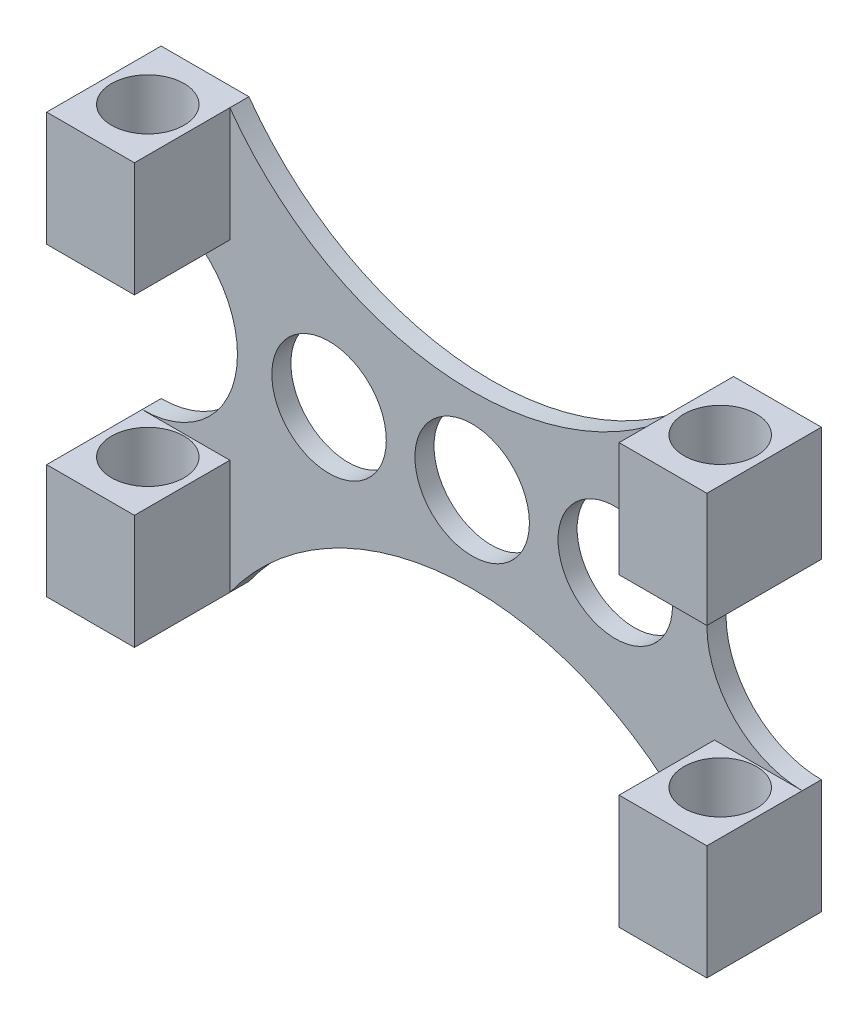
ISO-10303-21;
HEADER;
FILE_DESCRIPTION(('STEP AP214'),'2;1');
FILE_NAME('part.step','',(''),(''),'','','');
FILE_SCHEMA(('AUTOMOTIVE_DESIGN { 1 0 10303 214 1 1 1 1 }'));
ENDSEC;
DATA;
#1=APPLICATION_CONTEXT('core data for automotive mechanical design processes');
#2=APPLICATION_PROTOCOL_DEFINITION('international standard','automotive_design',2000,#1);
#3=PRODUCT_CONTEXT('',#1,'mechanical');
#4=PRODUCT('Part','Part','',(#3));
#5=PRODUCT_RELATED_PRODUCT_CATEGORY('part','',(#4));
#6=PRODUCT_DEFINITION_FORMATION('','',#4);
#7=PRODUCT_DEFINITION_CONTEXT('part definition',#1,'design');
#8=PRODUCT_DEFINITION('design','',#6,#7);
#9=PRODUCT_DEFINITION_SHAPE('','',#8);
#10=(LENGTH_UNIT() NAMED_UNIT(*) SI_UNIT(.MILLI.,.METRE.));
#11=(NAMED_UNIT(*) PLANE_ANGLE_UNIT() SI_UNIT($,.RADIAN.));
#12=(NAMED_UNIT(*) SI_UNIT($,.STERADIAN.) SOLID_ANGLE_UNIT());
#13=UNCERTAINTY_MEASURE_WITH_UNIT(LENGTH_MEASURE(1.E-05),#10,'distance_accuracy_value','');
#14=(GEOMETRIC_REPRESENTATION_CONTEXT(3) GLOBAL_UNCERTAINTY_ASSIGNED_CONTEXT((#13)) GLOBAL_UNIT_ASSIGNED_CONTEXT((#10,
#11,#12)) REPRESENTATION_CONTEXT('',''));
#15=CARTESIAN_POINT('',(0.,0.,0.));
#16=DIRECTION('',(0.,0.,1.));
#17=DIRECTION('',(1.,0.,0.));
#18=AXIS2_PLACEMENT_3D('',#15,#16,#17);
#19=CARTESIAN_POINT('',(-51.1120429281433,-49.8909296039153,5.));
#20=DIRECTION('',(0.,0.,1.));
#21=DIRECTION('',(1.,0.,0.));
#22=AXIS2_PLACEMENT_3D('',#19,#20,#21);
#23=PLANE('',#22);
#24=CARTESIAN_POINT('',(-2.11204292814329,-49.8909296039153,5.));
#25=DIRECTION('',(0.,0.,1.));
#26=DIRECTION('',(1.,0.,0.));
#27=AXIS2_PLACEMENT_3D('',#24,#25,#26);
#28=CIRCLE('',#27,15.);
#29=CARTESIAN_POINT('',(12.8879570718567,-49.8909296039153,5.));
#30=VERTEX_POINT('',#29);
#31=EDGE_CURVE('E311',#30,#30,#28,.T.);
#32=ORIENTED_EDGE('',*,*,#31,.F.);
#33=EDGE_LOOP('',(#32));
#34=FACE_BOUND('',#33,.T.);
#35=CARTESIAN_POINT('',(35.3879570718567,-49.8909296039153,5.));
#36=DIRECTION('',(0.,0.,1.));
#37=DIRECTION('',(1.,0.,0.));
#38=AXIS2_PLACEMENT_3D('',#35,#36,#37);
#39=CIRCLE('',#38,15.);
#40=CARTESIAN_POINT('',(50.3879570718567,-49.8909296039153,5.));
#41=VERTEX_POINT('',#40);
#42=EDGE_CURVE('E323',#41,#41,#39,.T.);
#43=ORIENTED_EDGE('',*,*,#42,.F.);
#44=EDGE_LOOP('',(#43));
#45=FACE_BOUND('',#44,.T.);
#46=CARTESIAN_POINT('',(72.8879570718567,-49.8909296039153,5.));
#47=DIRECTION('',(0.,0.,1.));
#48=DIRECTION('',(1.,0.,0.));
#49=AXIS2_PLACEMENT_3D('',#46,#47,#48);
#50=CIRCLE('',#49,15.);
#51=CARTESIAN_POINT('',(87.8879570718567,-49.8909296039153,5.));
#52=VERTEX_POINT('',#51);
#53=EDGE_CURVE('E317',#52,#52,#50,.T.);
#54=ORIENTED_EDGE('',*,*,#53,.F.);
#55=EDGE_LOOP('',(#54));
#56=FACE_BOUND('',#55,.T.);
#57=DIRECTION('',(-1.,0.,0.));
#58=VECTOR('',#57,1.);
#59=CARTESIAN_POINT('',(-51.1120429281432,-74.8909296039153,5.));
#60=LINE('',#59,#58);
#61=CARTESIAN_POINT('',(-28.1120429281433,-74.8909296039153,5.));
#62=VERTEX_POINT('',#61);
#63=CARTESIAN_POINT('',(-51.1120429281432,-74.8909296039153,5.));
#64=VERTEX_POINT('',#63);
#65=EDGE_CURVE('E50',#62,#64,#60,.T.);
#66=ORIENTED_EDGE('',*,*,#65,.F.);
#67=DIRECTION('',(0.,1.,0.));
#68=VECTOR('',#67,1.);
#69=CARTESIAN_POINT('',(-28.1120429281433,-104.890929603915,5.));
#70=LINE('',#69,#68);
#71=CARTESIAN_POINT('',(-28.1120429281433,-104.890929603915,5.));
#72=VERTEX_POINT('',#71);
#73=EDGE_CURVE('E214',#72,#62,#70,.T.);
#74=ORIENTED_EDGE('',*,*,#73,.F.);
#75=CARTESIAN_POINT('',(35.3879570718567,-150.404563471569,5.));
#76=DIRECTION('',(0.,0.,-1.));
#77=DIRECTION('',(-1.,0.,0.));
#78=AXIS2_PLACEMENT_3D('',#75,#76,#77);
#79=CIRCLE('',#78,78.1264415408689);
#80=CARTESIAN_POINT('',(98.8865470002782,-104.888962355677,5.));
#81=VERTEX_POINT('',#80);
#82=EDGE_CURVE('E331',#72,#81,#79,.T.);
#83=ORIENTED_EDGE('',*,*,#82,.T.);
#84=DIRECTION('',(0.,-1.,0.));
#85=VECTOR('',#84,1.);
#86=CARTESIAN_POINT('',(98.8865470002782,-104.890929603915,5.));
#87=LINE('',#86,#85);
#88=CARTESIAN_POINT('',(98.8865470002783,-74.8909296039153,5.));
#89=VERTEX_POINT('',#88);
#90=EDGE_CURVE('E57',#89,#81,#87,.T.);
#91=ORIENTED_EDGE('',*,*,#90,.F.);
#92=DIRECTION('',(-1.,0.,0.));
#93=VECTOR('',#92,1.);
#94=CARTESIAN_POINT('',(121.887957071857,-74.8909296039153,5.));
#95=LINE('',#94,#93);
#96=CARTESIAN_POINT('',(121.887957071857,-74.8909296039153,5.));
#97=VERTEX_POINT('',#96);
#98=EDGE_CURVE('E229',#97,#89,#95,.T.);
#99=ORIENTED_EDGE('',*,*,#98,.F.);
#100=CARTESIAN_POINT('',(121.887957071857,-49.8909296039153,5.));
#101=DIRECTION('',(0.,0.,-1.));
#102=DIRECTION('',(-1.,0.,0.));
#103=AXIS2_PLACEMENT_3D('',#100,#101,#102);
#104=CIRCLE('',#103,25.);
#105=CARTESIAN_POINT('',(121.887957071857,-24.8909296039153,5.));
#106=VERTEX_POINT('',#105);
#107=EDGE_CURVE('E334',#97,#106,#104,.T.);
#108=ORIENTED_EDGE('',*,*,#107,.T.);
#109=DIRECTION('',(1.,0.,0.));
#110=VECTOR('',#109,1.);
#111=CARTESIAN_POINT('',(121.887957071857,-24.8909296039153,5.));
#112=LINE('',#111,#110);
#113=CARTESIAN_POINT('',(98.8865470002782,-24.8909296039153,5.));
#114=VERTEX_POINT('',#113);
#115=EDGE_CURVE('E263',#114,#106,#112,.T.);
#116=ORIENTED_EDGE('',*,*,#115,.F.);
#117=DIRECTION('',(0.,-1.,0.));
#118=VECTOR('',#117,1.);
#119=CARTESIAN_POINT('',(98.8865470002782,5.10907039608473,5.));
#120=LINE('',#119,#118);
#121=CARTESIAN_POINT('',(98.8865470002782,5.10710314784629,5.));
#122=VERTEX_POINT('',#121);
#123=EDGE_CURVE('E271',#122,#114,#120,.T.);
#124=ORIENTED_EDGE('',*,*,#123,.F.);
#125=CARTESIAN_POINT('',(35.3879570718567,50.6227042637381,5.));
#126=DIRECTION('',(0.,0.,-1.));
#127=DIRECTION('',(1.,0.,0.));
#128=AXIS2_PLACEMENT_3D('',#125,#126,#127);
#129=CIRCLE('',#128,78.1264415408689);
#130=CARTESIAN_POINT('',(-28.1120429281433,5.10907039608473,5.));
#131=VERTEX_POINT('',#130);
#132=EDGE_CURVE('E336',#122,#131,#129,.T.);
#133=ORIENTED_EDGE('',*,*,#132,.T.);
#134=DIRECTION('',(0.,1.,0.));
#135=VECTOR('',#134,1.);
#136=CARTESIAN_POINT('',(-28.1120429281433,5.10907039608473,5.));
#137=LINE('',#136,#135);
#138=CARTESIAN_POINT('',(-28.1120429281433,-24.8909296039153,5.));
#139=VERTEX_POINT('',#138);
#140=EDGE_CURVE('E290',#139,#131,#137,.T.);
#141=ORIENTED_EDGE('',*,*,#140,.F.);
#142=DIRECTION('',(1.,0.,0.));
#143=VECTOR('',#142,1.);
#144=CARTESIAN_POINT('',(-51.1120429281433,-24.8909296039153,5.));
#145=LINE('',#144,#143);
#146=CARTESIAN_POINT('',(-51.1120429281433,-24.8909296039153,5.));
#147=VERTEX_POINT('',#146);
#148=EDGE_CURVE('E285',#147,#139,#145,.T.);
#149=ORIENTED_EDGE('',*,*,#148,.F.);
#150=CARTESIAN_POINT('',(-51.1120429281433,-49.8909296039153,5.));
#151=DIRECTION('',(0.,0.,-1.));
#152=DIRECTION('',(1.,0.,0.));
#153=AXIS2_PLACEMENT_3D('',#150,#151,#152);
#154=CIRCLE('',#153,25.);
#155=EDGE_CURVE('E329',#147,#64,#154,.T.);
#156=ORIENTED_EDGE('',*,*,#155,.T.);
#157=EDGE_LOOP('',(#66,#74,#83,#91,#99,#108,#116,#124,#133,#141,#149,#156));
#158=FACE_BOUND('',#157,.T.);
#159=ADVANCED_FACE('F33',(#34,#45,#56,#158),#23,.T.);
#160=CARTESIAN_POINT('',(-51.1120429281433,-49.8909296039153,0.));
#161=DIRECTION('',(0.,0.,1.));
#162=DIRECTION('',(1.,0.,0.));
#163=AXIS2_PLACEMENT_3D('',#160,#161,#162);
#164=PLANE('',#163);
#165=CARTESIAN_POINT('',(72.8879570718567,-49.8909296039153,0.));
#166=DIRECTION('',(0.,0.,1.));
#167=DIRECTION('',(1.,0.,0.));
#168=AXIS2_PLACEMENT_3D('',#165,#166,#167);
#169=CIRCLE('',#168,15.);
#170=CARTESIAN_POINT('',(87.8879570718567,-49.8909296039153,0.));
#171=VERTEX_POINT('',#170);
#172=EDGE_CURVE('E314',#171,#171,#169,.T.);
#173=ORIENTED_EDGE('',*,*,#172,.T.);
#174=EDGE_LOOP('',(#173));
#175=FACE_BOUND('',#174,.T.);
#176=DIRECTION('',(0.,-1.,0.));
#177=VECTOR('',#176,1.);
#178=CARTESIAN_POINT('',(-51.1120429281433,5.10907039608473,0.));
#179=LINE('',#178,#177);
#180=CARTESIAN_POINT('',(-51.1120429281433,5.10907039608473,0.));
#181=VERTEX_POINT('',#180);
#182=CARTESIAN_POINT('',(-51.1120429281433,-24.8909296039153,0.));
#183=VERTEX_POINT('',#182);
#184=EDGE_CURVE('E326',#181,#183,#179,.T.);
#185=ORIENTED_EDGE('',*,*,#184,.F.);
#186=DIRECTION('',(-1.,0.,0.));
#187=VECTOR('',#186,1.);
#188=CARTESIAN_POINT('',(-51.1120429281433,5.10907039608473,0.));
#189=LINE('',#188,#187);
#190=CARTESIAN_POINT('',(-28.1120429281433,5.10907039608473,0.));
#191=VERTEX_POINT('',#190);
#192=EDGE_CURVE('E332',#191,#181,#189,.T.);
#193=ORIENTED_EDGE('',*,*,#192,.F.);
#194=CARTESIAN_POINT('',(35.3879570718567,50.6227042637381,0.));
#195=DIRECTION('',(0.,0.,-1.));
#196=DIRECTION('',(1.,0.,0.));
#197=AXIS2_PLACEMENT_3D('',#194,#195,#196);
#198=CIRCLE('',#197,78.1264415408689);
#199=CARTESIAN_POINT('',(98.8879570718567,5.10907039608473,0.));
#200=VERTEX_POINT('',#199);
#201=EDGE_CURVE('E360',#200,#191,#198,.T.);
#202=ORIENTED_EDGE('',*,*,#201,.F.);
#203=DIRECTION('',(-1.,0.,0.));
#204=VECTOR('',#203,1.);
#205=CARTESIAN_POINT('',(98.8879570718567,5.10907039608473,0.));
#206=LINE('',#205,#204);
#207=CARTESIAN_POINT('',(121.887957071857,5.10907039608474,0.));
#208=VERTEX_POINT('',#207);
#209=EDGE_CURVE('E358',#208,#200,#206,.T.);
#210=ORIENTED_EDGE('',*,*,#209,.F.);
#211=DIRECTION('',(0.,1.,0.));
#212=VECTOR('',#211,1.);
#213=CARTESIAN_POINT('',(121.887957071857,5.10907039608474,0.));
#214=LINE('',#213,#212);
#215=CARTESIAN_POINT('',(121.887957071857,-24.8909296039153,0.));
#216=VERTEX_POINT('',#215);
#217=EDGE_CURVE('E356',#216,#208,#214,.T.);
#218=ORIENTED_EDGE('',*,*,#217,.F.);
#219=CARTESIAN_POINT('',(121.887957071857,-49.8909296039153,0.));
#220=DIRECTION('',(0.,0.,-1.));
#221=DIRECTION('',(-1.,0.,0.));
#222=AXIS2_PLACEMENT_3D('',#219,#220,#221);
#223=CIRCLE('',#222,25.);
#224=CARTESIAN_POINT('',(121.887957071857,-74.8909296039153,0.));
#225=VERTEX_POINT('',#224);
#226=EDGE_CURVE('E354',#225,#216,#223,.T.);
#227=ORIENTED_EDGE('',*,*,#226,.F.);
#228=DIRECTION('',(0.,1.,0.));
#229=VECTOR('',#228,1.);
#230=CARTESIAN_POINT('',(121.887957071857,-74.8909296039153,0.));
#231=LINE('',#230,#229);
#232=CARTESIAN_POINT('',(121.887957071857,-104.890929603915,0.));
#233=VERTEX_POINT('',#232);
#234=EDGE_CURVE('E352',#233,#225,#231,.T.);
#235=ORIENTED_EDGE('',*,*,#234,.F.);
#236=DIRECTION('',(1.,0.,0.));
#237=VECTOR('',#236,1.);
#238=CARTESIAN_POINT('',(98.8879570718567,-104.890929603915,0.));
#239=LINE('',#238,#237);
#240=CARTESIAN_POINT('',(98.8879570718567,-104.890929603915,0.));
#241=VERTEX_POINT('',#240);
#242=EDGE_CURVE('E350',#241,#233,#239,.T.);
#243=ORIENTED_EDGE('',*,*,#242,.F.);
#244=CARTESIAN_POINT('',(35.3879570718567,-150.404563471569,0.));
#245=DIRECTION('',(0.,0.,-1.));
#246=DIRECTION('',(-1.,0.,0.));
#247=AXIS2_PLACEMENT_3D('',#244,#245,#246);
#248=CIRCLE('',#247,78.1264415408689);
#249=CARTESIAN_POINT('',(-28.1120429281433,-104.890929603915,0.));
#250=VERTEX_POINT('',#249);
#251=EDGE_CURVE('E348',#250,#241,#248,.T.);
#252=ORIENTED_EDGE('',*,*,#251,.F.);
#253=DIRECTION('',(1.,0.,0.));
#254=VECTOR('',#253,1.);
#255=CARTESIAN_POINT('',(-51.1120429281432,-104.890929603915,0.));
#256=LINE('',#255,#254);
#257=CARTESIAN_POINT('',(-51.1120429281432,-104.890929603915,0.));
#258=VERTEX_POINT('',#257);
#259=EDGE_CURVE('E346',#258,#250,#256,.T.);
#260=ORIENTED_EDGE('',*,*,#259,.F.);
#261=DIRECTION('',(0.,-1.,0.));
#262=VECTOR('',#261,1.);
#263=CARTESIAN_POINT('',(-51.1120429281432,-74.8909296039153,0.));
#264=LINE('',#263,#262);
#265=CARTESIAN_POINT('',(-51.1120429281432,-74.8909296039153,0.));
#266=VERTEX_POINT('',#265);
#267=EDGE_CURVE('E194',#266,#258,#264,.T.);
#268=ORIENTED_EDGE('',*,*,#267,.F.);
#269=CARTESIAN_POINT('',(-51.1120429281433,-49.8909296039153,0.));
#270=DIRECTION('',(0.,0.,-1.));
#271=DIRECTION('',(1.,0.,0.));
#272=AXIS2_PLACEMENT_3D('',#269,#270,#271);
#273=CIRCLE('',#272,25.);
#274=EDGE_CURVE('E343',#183,#266,#273,.T.);
#275=ORIENTED_EDGE('',*,*,#274,.F.);
#276=EDGE_LOOP('',(#185,#193,#202,#210,#218,#227,#235,#243,#252,#260,#268,#275));
#277=FACE_BOUND('',#276,.T.);
#278=CARTESIAN_POINT('',(35.3879570718567,-49.8909296039153,0.));
#279=DIRECTION('',(0.,0.,1.));
#280=DIRECTION('',(1.,0.,0.));
#281=AXIS2_PLACEMENT_3D('',#278,#279,#280);
#282=CIRCLE('',#281,15.);
#283=CARTESIAN_POINT('',(50.3879570718567,-49.8909296039153,0.));
#284=VERTEX_POINT('',#283);
#285=EDGE_CURVE('E320',#284,#284,#282,.T.);
#286=ORIENTED_EDGE('',*,*,#285,.T.);
#287=EDGE_LOOP('',(#286));
#288=FACE_BOUND('',#287,.T.);
#289=CARTESIAN_POINT('',(-2.11204292814329,-49.8909296039153,0.));
#290=DIRECTION('',(0.,0.,1.));
#291=DIRECTION('',(1.,0.,0.));
#292=AXIS2_PLACEMENT_3D('',#289,#290,#291);
#293=CIRCLE('',#292,15.);
#294=CARTESIAN_POINT('',(12.8879570718567,-49.8909296039153,0.));
#295=VERTEX_POINT('',#294);
#296=EDGE_CURVE('E310',#295,#295,#293,.T.);
#297=ORIENTED_EDGE('',*,*,#296,.T.);
#298=EDGE_LOOP('',(#297));
#299=FACE_BOUND('',#298,.T.);
#300=ADVANCED_FACE('F427',(#175,#277,#288,#299),#164,.F.);
#301=CARTESIAN_POINT('',(-51.1120429281433,5.10907039608473,5.));
#302=DIRECTION('',(1.,0.,0.));
#303=DIRECTION('',(0.,1.,0.));
#304=AXIS2_PLACEMENT_3D('',#301,#302,#303);
#305=PLANE('',#304);
#306=ORIENTED_EDGE('',*,*,#184,.T.);
#307=DIRECTION('',(0.,0.,-1.));
#308=VECTOR('',#307,1.);
#309=CARTESIAN_POINT('',(-51.1120429281433,-24.8909296039153,5.));
#310=LINE('',#309,#308);
#311=EDGE_CURVE('E11',#147,#183,#310,.T.);
#312=ORIENTED_EDGE('',*,*,#311,.F.);
#313=DIRECTION('',(0.,0.,-1.));
#314=VECTOR('',#313,1.);
#315=CARTESIAN_POINT('',(-51.1120429281433,-24.8909296039153,30.));
#316=LINE('',#315,#314);
#317=CARTESIAN_POINT('',(-51.1120429281433,-24.8909296039153,30.));
#318=VERTEX_POINT('',#317);
#319=EDGE_CURVE('E307',#318,#147,#316,.T.);
#320=ORIENTED_EDGE('',*,*,#319,.F.);
#321=DIRECTION('',(0.,-1.,0.));
#322=VECTOR('',#321,1.);
#323=CARTESIAN_POINT('',(-51.1120429281433,5.10907039608473,30.));
#324=LINE('',#323,#322);
#325=CARTESIAN_POINT('',(-51.1120429281433,5.10907039608473,30.));
#326=VERTEX_POINT('',#325);
#327=EDGE_CURVE('E286',#326,#318,#324,.T.);
#328=ORIENTED_EDGE('',*,*,#327,.F.);
#329=DIRECTION('',(0.,0.,-1.));
#330=VECTOR('',#329,1.);
#331=CARTESIAN_POINT('',(-51.1120429281433,5.10907039608473,5.));
#332=LINE('',#331,#330);
#333=EDGE_CURVE('E340',#326,#181,#332,.T.);
#334=ORIENTED_EDGE('',*,*,#333,.T.);
#335=EDGE_LOOP('',(#306,#312,#320,#328,#334));
#336=FACE_BOUND('',#335,.T.);
#337=ADVANCED_FACE('F35',(#336),#305,.F.);
#338=CARTESIAN_POINT('',(-51.1120429281433,-49.8909296039153,5.));
#339=DIRECTION('',(0.,0.,-1.));
#340=DIRECTION('',(-1.,0.,0.));
#341=AXIS2_PLACEMENT_3D('',#338,#339,#340);
#342=CYLINDRICAL_SURFACE('',#341,25.);
#343=ORIENTED_EDGE('',*,*,#274,.T.);
#344=DIRECTION('',(0.,0.,-1.));
#345=VECTOR('',#344,1.);
#346=CARTESIAN_POINT('',(-51.1120429281432,-74.8909296039153,5.));
#347=LINE('',#346,#345);
#348=EDGE_CURVE('E42',#64,#266,#347,.T.);
#349=ORIENTED_EDGE('',*,*,#348,.F.);
#350=ORIENTED_EDGE('',*,*,#155,.F.);
#351=ORIENTED_EDGE('',*,*,#311,.T.);
#352=EDGE_LOOP('',(#343,#349,#350,#351));
#353=FACE_BOUND('',#352,.T.);
#354=ADVANCED_FACE('F424',(#353),#342,.F.);
#355=CARTESIAN_POINT('',(-51.1120429281432,-74.8909296039153,5.));
#356=DIRECTION('',(1.,0.,0.));
#357=DIRECTION('',(0.,0.,-1.));
#358=AXIS2_PLACEMENT_3D('',#355,#356,#357);
#359=PLANE('',#358);
#360=ORIENTED_EDGE('',*,*,#267,.T.);
#361=DIRECTION('',(0.,0.,-1.));
#362=VECTOR('',#361,1.);
#363=CARTESIAN_POINT('',(-51.1120429281432,-104.890929603915,5.));
#364=LINE('',#363,#362);
#365=CARTESIAN_POINT('',(-51.1120429281432,-104.890929603915,30.));
#366=VERTEX_POINT('',#365);
#367=EDGE_CURVE('E186',#366,#258,#364,.T.);
#368=ORIENTED_EDGE('',*,*,#367,.F.);
#369=DIRECTION('',(0.,-1.,0.));
#370=VECTOR('',#369,1.);
#371=CARTESIAN_POINT('',(-51.1120429281432,-104.890929603915,30.));
#372=LINE('',#371,#370);
#373=CARTESIAN_POINT('',(-51.1120429281432,-74.8909296039153,30.));
#374=VERTEX_POINT('',#373);
#375=EDGE_CURVE('E191',#374,#366,#372,.T.);
#376=ORIENTED_EDGE('',*,*,#375,.F.);
#377=DIRECTION('',(0.,0.,-1.));
#378=VECTOR('',#377,1.);
#379=CARTESIAN_POINT('',(-51.1120429281432,-74.8909296039153,30.));
#380=LINE('',#379,#378);
#381=EDGE_CURVE('E222',#374,#64,#380,.T.);
#382=ORIENTED_EDGE('',*,*,#381,.T.);
#383=ORIENTED_EDGE('',*,*,#348,.T.);
#384=EDGE_LOOP('',(#360,#368,#376,#382,#383));
#385=FACE_BOUND('',#384,.T.);
#386=ADVANCED_FACE('F188',(#385),#359,.F.);
#387=CARTESIAN_POINT('',(-51.1120429281432,-104.890929603915,5.));
#388=DIRECTION('',(0.,1.,0.));
#389=DIRECTION('',(0.,0.,1.));
#390=AXIS2_PLACEMENT_3D('',#387,#388,#389);
#391=PLANE('',#390);
#392=CARTESIAN_POINT('',(-39.6120429281433,-104.890929603915,15.));
#393=DIRECTION('',(0.,-1.,0.));
#394=DIRECTION('',(0.,0.,-1.));
#395=AXIS2_PLACEMENT_3D('',#392,#393,#394);
#396=CIRCLE('',#395,9.5);
#397=CARTESIAN_POINT('',(-39.6120429281433,-104.890929603915,5.5));
#398=VERTEX_POINT('',#397);
#399=EDGE_CURVE('E407',#398,#398,#396,.T.);
#400=ORIENTED_EDGE('',*,*,#399,.F.);
#401=EDGE_LOOP('',(#400));
#402=FACE_BOUND('',#401,.T.);
#403=ORIENTED_EDGE('',*,*,#259,.T.);
#404=DIRECTION('',(0.,0.,-1.));
#405=VECTOR('',#404,1.);
#406=CARTESIAN_POINT('',(-28.1120429281433,-104.890929603915,5.));
#407=LINE('',#406,#405);
#408=EDGE_CURVE('E197',#72,#250,#407,.T.);
#409=ORIENTED_EDGE('',*,*,#408,.F.);
#410=DIRECTION('',(0.,0.,-1.));
#411=VECTOR('',#410,1.);
#412=CARTESIAN_POINT('',(-28.1120429281433,-104.890929603915,30.));
#413=LINE('',#412,#411);
#414=CARTESIAN_POINT('',(-28.1120429281433,-104.890929603915,30.));
#415=VERTEX_POINT('',#414);
#416=EDGE_CURVE('E204',#415,#72,#413,.T.);
#417=ORIENTED_EDGE('',*,*,#416,.F.);
#418=DIRECTION('',(1.,0.,0.));
#419=VECTOR('',#418,1.);
#420=CARTESIAN_POINT('',(-51.1120429281432,-104.890929603915,30.));
#421=LINE('',#420,#419);
#422=EDGE_CURVE('E200',#366,#415,#421,.T.);
#423=ORIENTED_EDGE('',*,*,#422,.F.);
#424=ORIENTED_EDGE('',*,*,#367,.T.);
#425=EDGE_LOOP('',(#403,#409,#417,#423,#424));
#426=FACE_BOUND('',#425,.T.);
#427=ADVANCED_FACE('F201',(#402,#426),#391,.F.);
#428=CARTESIAN_POINT('',(35.3879570718567,-150.404563471569,5.));
#429=DIRECTION('',(0.,0.,-1.));
#430=DIRECTION('',(-1.,0.,0.));
#431=AXIS2_PLACEMENT_3D('',#428,#429,#430);
#432=CYLINDRICAL_SURFACE('',#431,78.1264415408689);
#433=ORIENTED_EDGE('',*,*,#251,.T.);
#434=DIRECTION('',(0.,0.,-1.));
#435=VECTOR('',#434,1.);
#436=CARTESIAN_POINT('',(98.8879570718567,-104.890929603915,5.));
#437=LINE('',#436,#435);
#438=CARTESIAN_POINT('',(98.8879570718567,-104.890929603915,5.));
#439=VERTEX_POINT('',#438);
#440=EDGE_CURVE('E383',#439,#241,#437,.T.);
#441=ORIENTED_EDGE('',*,*,#440,.F.);
#442=CARTESIAN_POINT('',(35.3879570718567,-150.404563471569,5.));
#443=DIRECTION('',(0.,0.,1.));
#444=DIRECTION('',(1.,0.,0.));
#445=AXIS2_PLACEMENT_3D('',#442,#443,#444);
#446=CIRCLE('',#445,78.1264415408689);
#447=EDGE_CURVE('E255',#81,#439,#446,.F.);
#448=ORIENTED_EDGE('',*,*,#447,.F.);
#449=ORIENTED_EDGE('',*,*,#82,.F.);
#450=ORIENTED_EDGE('',*,*,#408,.T.);
#451=EDGE_LOOP('',(#433,#441,#448,#449,#450));
#452=FACE_BOUND('',#451,.T.);
#453=ADVANCED_FACE('F415',(#452),#432,.F.);
#454=CARTESIAN_POINT('',(98.8879570718567,-104.890929603915,5.));
#455=DIRECTION('',(0.,1.,0.));
#456=DIRECTION('',(0.,0.,1.));
#457=AXIS2_PLACEMENT_3D('',#454,#455,#456);
#458=PLANE('',#457);
#459=CARTESIAN_POINT('',(110.387604553962,-104.890929603915,15.));
#460=DIRECTION('',(0.,-1.,0.));
#461=DIRECTION('',(0.,0.,-1.));
#462=AXIS2_PLACEMENT_3D('',#459,#460,#461);
#463=CIRCLE('',#462,9.49999999999999);
#464=CARTESIAN_POINT('',(110.387604553962,-104.890929603915,5.50000000000001));
#465=VERTEX_POINT('',#464);
#466=EDGE_CURVE('E395',#465,#465,#463,.T.);
#467=ORIENTED_EDGE('',*,*,#466,.F.);
#468=EDGE_LOOP('',(#467));
#469=FACE_BOUND('',#468,.T.);
#470=ORIENTED_EDGE('',*,*,#242,.T.);
#471=DIRECTION('',(0.,0.,-1.));
#472=VECTOR('',#471,1.);
#473=CARTESIAN_POINT('',(121.887957071857,-104.890929603915,5.));
#474=LINE('',#473,#472);
#475=CARTESIAN_POINT('',(121.887957071857,-104.890929603915,30.));
#476=VERTEX_POINT('',#475);
#477=EDGE_CURVE('E380',#476,#233,#474,.T.);
#478=ORIENTED_EDGE('',*,*,#477,.F.);
#479=DIRECTION('',(1.,0.,0.));
#480=VECTOR('',#479,1.);
#481=CARTESIAN_POINT('',(121.887957071857,-104.890929603915,30.));
#482=LINE('',#481,#480);
#483=CARTESIAN_POINT('',(98.8865470002782,-104.890929603915,30.));
#484=VERTEX_POINT('',#483);
#485=EDGE_CURVE('E238',#484,#476,#482,.T.);
#486=ORIENTED_EDGE('',*,*,#485,.F.);
#487=DIRECTION('',(0.,0.,-1.));
#488=VECTOR('',#487,1.);
#489=CARTESIAN_POINT('',(98.8865470002782,-104.890929603915,30.));
#490=LINE('',#489,#488);
#491=CARTESIAN_POINT('',(98.8865470002782,-104.890929603915,5.));
#492=VERTEX_POINT('',#491);
#493=EDGE_CURVE('E241',#484,#492,#490,.T.);
#494=ORIENTED_EDGE('',*,*,#493,.T.);
#495=DIRECTION('',(1.,0.,0.));
#496=VECTOR('',#495,1.);
#497=CARTESIAN_POINT('',(121.887957071857,-104.890929603915,5.));
#498=LINE('',#497,#496);
#499=EDGE_CURVE('E234',#492,#439,#498,.T.);
#500=ORIENTED_EDGE('',*,*,#499,.T.);
#501=ORIENTED_EDGE('',*,*,#440,.T.);
#502=EDGE_LOOP('',(#470,#478,#486,#494,#500,#501));
#503=FACE_BOUND('',#502,.T.);
#504=ADVANCED_FACE('F421',(#469,#503),#458,.F.);
#505=CARTESIAN_POINT('',(121.887957071857,-74.8909296039153,5.));
#506=DIRECTION('',(-1.,0.,0.));
#507=DIRECTION('',(0.,-1.,0.));
#508=AXIS2_PLACEMENT_3D('',#505,#506,#507);
#509=PLANE('',#508);
#510=ORIENTED_EDGE('',*,*,#234,.T.);
#511=DIRECTION('',(0.,0.,-1.));
#512=VECTOR('',#511,1.);
#513=CARTESIAN_POINT('',(121.887957071857,-74.8909296039153,5.));
#514=LINE('',#513,#512);
#515=EDGE_CURVE('E377',#97,#225,#514,.T.);
#516=ORIENTED_EDGE('',*,*,#515,.F.);
#517=DIRECTION('',(0.,0.,-1.));
#518=VECTOR('',#517,1.);
#519=CARTESIAN_POINT('',(121.887957071857,-74.8909296039153,30.));
#520=LINE('',#519,#518);
#521=CARTESIAN_POINT('',(121.887957071857,-74.8909296039153,30.));
#522=VERTEX_POINT('',#521);
#523=EDGE_CURVE('E252',#522,#97,#520,.T.);
#524=ORIENTED_EDGE('',*,*,#523,.F.);
#525=DIRECTION('',(0.,1.,0.));
#526=VECTOR('',#525,1.);
#527=CARTESIAN_POINT('',(121.887957071857,-104.890929603915,30.));
#528=LINE('',#527,#526);
#529=EDGE_CURVE('E230',#476,#522,#528,.T.);
#530=ORIENTED_EDGE('',*,*,#529,.F.);
#531=ORIENTED_EDGE('',*,*,#477,.T.);
#532=EDGE_LOOP('',(#510,#516,#524,#530,#531));
#533=FACE_BOUND('',#532,.T.);
#534=ADVANCED_FACE('F460',(#533),#509,.F.);
#535=CARTESIAN_POINT('',(121.887957071857,-49.8909296039153,5.));
#536=DIRECTION('',(0.,0.,-1.));
#537=DIRECTION('',(-1.,0.,0.));
#538=AXIS2_PLACEMENT_3D('',#535,#536,#537);
#539=CYLINDRICAL_SURFACE('',#538,25.);
#540=ORIENTED_EDGE('',*,*,#226,.T.);
#541=DIRECTION('',(0.,0.,-1.));
#542=VECTOR('',#541,1.);
#543=CARTESIAN_POINT('',(121.887957071857,-24.8909296039153,5.));
#544=LINE('',#543,#542);
#545=EDGE_CURVE('E374',#106,#216,#544,.T.);
#546=ORIENTED_EDGE('',*,*,#545,.F.);
#547=ORIENTED_EDGE('',*,*,#107,.F.);
#548=ORIENTED_EDGE('',*,*,#515,.T.);
#549=EDGE_LOOP('',(#540,#546,#547,#548));
#550=FACE_BOUND('',#549,.T.);
#551=ADVANCED_FACE('F456',(#550),#539,.F.);
#552=CARTESIAN_POINT('',(121.887957071857,5.10907039608474,5.));
#553=DIRECTION('',(-1.,0.,0.));
#554=DIRECTION('',(0.,-1.,0.));
#555=AXIS2_PLACEMENT_3D('',#552,#553,#554);
#556=PLANE('',#555);
#557=ORIENTED_EDGE('',*,*,#217,.T.);
#558=DIRECTION('',(0.,0.,-1.));
#559=VECTOR('',#558,1.);
#560=CARTESIAN_POINT('',(121.887957071857,5.10907039608474,5.));
#561=LINE('',#560,#559);
#562=CARTESIAN_POINT('',(121.887957071857,5.10907039608474,30.));
#563=VERTEX_POINT('',#562);
#564=EDGE_CURVE('E371',#563,#208,#561,.T.);
#565=ORIENTED_EDGE('',*,*,#564,.F.);
#566=DIRECTION('',(0.,1.,0.));
#567=VECTOR('',#566,1.);
#568=CARTESIAN_POINT('',(121.887957071857,5.10907039608474,30.));
#569=LINE('',#568,#567);
#570=CARTESIAN_POINT('',(121.887957071857,-24.8909296039153,30.));
#571=VERTEX_POINT('',#570);
#572=EDGE_CURVE('E259',#571,#563,#569,.T.);
#573=ORIENTED_EDGE('',*,*,#572,.F.);
#574=DIRECTION('',(0.,0.,-1.));
#575=VECTOR('',#574,1.);
#576=CARTESIAN_POINT('',(121.887957071857,-24.8909296039153,30.));
#577=LINE('',#576,#575);
#578=EDGE_CURVE('E269',#571,#106,#577,.T.);
#579=ORIENTED_EDGE('',*,*,#578,.T.);
#580=ORIENTED_EDGE('',*,*,#545,.T.);
#581=EDGE_LOOP('',(#557,#565,#573,#579,#580));
#582=FACE_BOUND('',#581,.T.);
#583=ADVANCED_FACE('F452',(#582),#556,.F.);
#584=CARTESIAN_POINT('',(98.8879570718567,5.10907039608473,5.));
#585=DIRECTION('',(0.,-1.,0.));
#586=DIRECTION('',(1.,0.,0.));
#587=AXIS2_PLACEMENT_3D('',#584,#585,#586);
#588=PLANE('',#587);
#589=CARTESIAN_POINT('',(110.387604553962,5.10907039608473,15.));
#590=DIRECTION('',(0.,-1.,0.));
#591=DIRECTION('',(0.,0.,-1.));
#592=AXIS2_PLACEMENT_3D('',#589,#590,#591);
#593=CIRCLE('',#592,9.49999999999999);
#594=CARTESIAN_POINT('',(110.387604553962,5.10907039608473,5.50000000000001));
#595=VERTEX_POINT('',#594);
#596=EDGE_CURVE('E390',#595,#595,#593,.F.);
#597=ORIENTED_EDGE('',*,*,#596,.F.);
#598=EDGE_LOOP('',(#597));
#599=FACE_BOUND('',#598,.T.);
#600=ORIENTED_EDGE('',*,*,#209,.T.);
#601=DIRECTION('',(0.,0.,-1.));
#602=VECTOR('',#601,1.);
#603=CARTESIAN_POINT('',(98.8879570718567,5.10907039608473,5.));
#604=LINE('',#603,#602);
#605=CARTESIAN_POINT('',(98.8879570718567,5.10907039608473,5.));
#606=VERTEX_POINT('',#605);
#607=EDGE_CURVE('E368',#606,#200,#604,.T.);
#608=ORIENTED_EDGE('',*,*,#607,.F.);
#609=DIRECTION('',(-1.,0.,0.));
#610=VECTOR('',#609,1.);
#611=CARTESIAN_POINT('',(121.887957071857,5.10907039608474,5.));
#612=LINE('',#611,#610);
#613=CARTESIAN_POINT('',(98.8865470002782,5.10907039608473,5.));
#614=VERTEX_POINT('',#613);
#615=EDGE_CURVE('E258',#606,#614,#612,.T.);
#616=ORIENTED_EDGE('',*,*,#615,.T.);
#617=DIRECTION('',(0.,0.,-1.));
#618=VECTOR('',#617,1.);
#619=CARTESIAN_POINT('',(98.8865470002782,5.10907039608473,30.));
#620=LINE('',#619,#618);
#621=CARTESIAN_POINT('',(98.8865470002782,5.10907039608473,30.));
#622=VERTEX_POINT('',#621);
#623=EDGE_CURVE('E282',#622,#614,#620,.T.);
#624=ORIENTED_EDGE('',*,*,#623,.F.);
#625=DIRECTION('',(-1.,0.,0.));
#626=VECTOR('',#625,1.);
#627=CARTESIAN_POINT('',(121.887957071857,5.10907039608474,30.));
#628=LINE('',#627,#626);
#629=EDGE_CURVE('E262',#563,#622,#628,.T.);
#630=ORIENTED_EDGE('',*,*,#629,.F.);
#631=ORIENTED_EDGE('',*,*,#564,.T.);
#632=EDGE_LOOP('',(#600,#608,#616,#624,#630,#631));
#633=FACE_BOUND('',#632,.T.);
#634=ADVANCED_FACE('F448',(#599,#633),#588,.F.);
#635=CARTESIAN_POINT('',(35.3879570718567,50.6227042637381,5.));
#636=DIRECTION('',(0.,0.,-1.));
#637=DIRECTION('',(-1.,0.,0.));
#638=AXIS2_PLACEMENT_3D('',#635,#636,#637);
#639=CYLINDRICAL_SURFACE('',#638,78.1264415408689);
#640=ORIENTED_EDGE('',*,*,#201,.T.);
#641=DIRECTION('',(0.,0.,-1.));
#642=VECTOR('',#641,1.);
#643=CARTESIAN_POINT('',(-28.1120429281433,5.10907039608473,5.));
#644=LINE('',#643,#642);
#645=EDGE_CURVE('E365',#131,#191,#644,.T.);
#646=ORIENTED_EDGE('',*,*,#645,.F.);
#647=ORIENTED_EDGE('',*,*,#132,.F.);
#648=EDGE_CURVE('E337',#606,#122,#129,.T.);
#649=ORIENTED_EDGE('',*,*,#648,.F.);
#650=ORIENTED_EDGE('',*,*,#607,.T.);
#651=EDGE_LOOP('',(#640,#646,#647,#649,#650));
#652=FACE_BOUND('',#651,.T.);
#653=ADVANCED_FACE('F444',(#652),#639,.F.);
#654=CARTESIAN_POINT('',(-51.1120429281433,5.10907039608473,5.));
#655=DIRECTION('',(0.,-1.,0.));
#656=DIRECTION('',(0.,0.,-1.));
#657=AXIS2_PLACEMENT_3D('',#654,#655,#656);
#658=PLANE('',#657);
#659=CARTESIAN_POINT('',(-39.6120429281433,5.10907039608473,15.));
#660=DIRECTION('',(0.,-1.,0.));
#661=DIRECTION('',(0.,0.,-1.));
#662=AXIS2_PLACEMENT_3D('',#659,#660,#661);
#663=CIRCLE('',#662,9.5);
#664=CARTESIAN_POINT('',(-39.6120429281433,5.10907039608473,5.5));
#665=VERTEX_POINT('',#664);
#666=EDGE_CURVE('E404',#665,#665,#663,.F.);
#667=ORIENTED_EDGE('',*,*,#666,.F.);
#668=EDGE_LOOP('',(#667));
#669=FACE_BOUND('',#668,.T.);
#670=ORIENTED_EDGE('',*,*,#192,.T.);
#671=ORIENTED_EDGE('',*,*,#333,.F.);
#672=DIRECTION('',(-1.,0.,0.));
#673=VECTOR('',#672,1.);
#674=CARTESIAN_POINT('',(-51.1120429281433,5.10907039608473,30.));
#675=LINE('',#674,#673);
#676=CARTESIAN_POINT('',(-28.1120429281433,5.10907039608473,30.));
#677=VERTEX_POINT('',#676);
#678=EDGE_CURVE('E294',#677,#326,#675,.T.);
#679=ORIENTED_EDGE('',*,*,#678,.F.);
#680=DIRECTION('',(0.,0.,-1.));
#681=VECTOR('',#680,1.);
#682=CARTESIAN_POINT('',(-28.1120429281433,5.10907039608473,30.));
#683=LINE('',#682,#681);
#684=EDGE_CURVE('E297',#677,#131,#683,.T.);
#685=ORIENTED_EDGE('',*,*,#684,.T.);
#686=ORIENTED_EDGE('',*,*,#645,.T.);
#687=EDGE_LOOP('',(#670,#671,#679,#685,#686));
#688=FACE_BOUND('',#687,.T.);
#689=ADVANCED_FACE('F441',(#669,#688),#658,.F.);
#690=CARTESIAN_POINT('',(35.3879570718567,-49.8909296039153,5.));
#691=DIRECTION('',(0.,0.,-1.));
#692=DIRECTION('',(-1.,0.,0.));
#693=AXIS2_PLACEMENT_3D('',#690,#691,#692);
#694=CYLINDRICAL_SURFACE('',#693,15.);
#695=ORIENTED_EDGE('',*,*,#42,.T.);
#696=EDGE_LOOP('',(#695));
#697=FACE_BOUND('',#696,.T.);
#698=ORIENTED_EDGE('',*,*,#285,.F.);
#699=EDGE_LOOP('',(#698));
#700=FACE_BOUND('',#699,.T.);
#701=ADVANCED_FACE('F438',(#697,#700),#694,.F.);
#702=CARTESIAN_POINT('',(72.8879570718567,-49.8909296039153,5.));
#703=DIRECTION('',(0.,0.,-1.));
#704=DIRECTION('',(-1.,0.,0.));
#705=AXIS2_PLACEMENT_3D('',#702,#703,#704);
#706=CYLINDRICAL_SURFACE('',#705,15.);
#707=ORIENTED_EDGE('',*,*,#53,.T.);
#708=EDGE_LOOP('',(#707));
#709=FACE_BOUND('',#708,.T.);
#710=ORIENTED_EDGE('',*,*,#172,.F.);
#711=EDGE_LOOP('',(#710));
#712=FACE_BOUND('',#711,.T.);
#713=ADVANCED_FACE('F573',(#709,#712),#706,.F.);
#714=CARTESIAN_POINT('',(-2.11204292814329,-49.8909296039153,5.));
#715=DIRECTION('',(0.,0.,-1.));
#716=DIRECTION('',(-1.,0.,0.));
#717=AXIS2_PLACEMENT_3D('',#714,#715,#716);
#718=CYLINDRICAL_SURFACE('',#717,15.);
#719=ORIENTED_EDGE('',*,*,#31,.T.);
#720=EDGE_LOOP('',(#719));
#721=FACE_BOUND('',#720,.T.);
#722=ORIENTED_EDGE('',*,*,#296,.F.);
#723=EDGE_LOOP('',(#722));
#724=FACE_BOUND('',#723,.T.);
#725=ADVANCED_FACE('F570',(#721,#724),#718,.F.);
#726=CARTESIAN_POINT('',(-51.1120429281433,-24.8909296039153,30.));
#727=DIRECTION('',(0.,1.,0.));
#728=DIRECTION('',(-1.,0.,0.));
#729=AXIS2_PLACEMENT_3D('',#726,#727,#728);
#730=PLANE('',#729);
#731=CARTESIAN_POINT('',(-39.6120429281433,-24.8909296039153,15.));
#732=DIRECTION('',(0.,1.,0.));
#733=DIRECTION('',(-1.,0.,0.));
#734=AXIS2_PLACEMENT_3D('',#731,#732,#733);
#735=CIRCLE('',#734,9.5);
#736=CARTESIAN_POINT('',(-49.1120429281433,-24.8909296039153,15.));
#737=VERTEX_POINT('',#736);
#738=EDGE_CURVE('E399',#737,#737,#735,.T.);
#739=ORIENTED_EDGE('',*,*,#738,.T.);
#740=EDGE_LOOP('',(#739));
#741=FACE_BOUND('',#740,.T.);
#742=ORIENTED_EDGE('',*,*,#148,.T.);
#743=DIRECTION('',(0.,0.,-1.));
#744=VECTOR('',#743,1.);
#745=CARTESIAN_POINT('',(-28.1120429281433,-24.8909296039153,30.));
#746=LINE('',#745,#744);
#747=CARTESIAN_POINT('',(-28.1120429281433,-24.8909296039153,30.));
#748=VERTEX_POINT('',#747);
#749=EDGE_CURVE('E304',#748,#139,#746,.T.);
#750=ORIENTED_EDGE('',*,*,#749,.F.);
#751=DIRECTION('',(1.,0.,0.));
#752=VECTOR('',#751,1.);
#753=CARTESIAN_POINT('',(-51.1120429281433,-24.8909296039153,30.));
#754=LINE('',#753,#752);
#755=EDGE_CURVE('E289',#318,#748,#754,.T.);
#756=ORIENTED_EDGE('',*,*,#755,.F.);
#757=ORIENTED_EDGE('',*,*,#319,.T.);
#758=EDGE_LOOP('',(#742,#750,#756,#757));
#759=FACE_BOUND('',#758,.T.);
#760=ADVANCED_FACE('F509',(#741,#759),#730,.F.);
#761=CARTESIAN_POINT('',(-28.1120429281433,5.10907039608473,30.));
#762=DIRECTION('',(-1.,0.,0.));
#763=DIRECTION('',(0.,-1.,0.));
#764=AXIS2_PLACEMENT_3D('',#761,#762,#763);
#765=PLANE('',#764);
#766=ORIENTED_EDGE('',*,*,#140,.T.);
#767=ORIENTED_EDGE('',*,*,#684,.F.);
#768=DIRECTION('',(0.,1.,0.));
#769=VECTOR('',#768,1.);
#770=CARTESIAN_POINT('',(-28.1120429281433,5.10907039608473,30.));
#771=LINE('',#770,#769);
#772=EDGE_CURVE('E292',#748,#677,#771,.T.);
#773=ORIENTED_EDGE('',*,*,#772,.F.);
#774=ORIENTED_EDGE('',*,*,#749,.T.);
#775=EDGE_LOOP('',(#766,#767,#773,#774));
#776=FACE_BOUND('',#775,.T.);
#777=ADVANCED_FACE('F512',(#776),#765,.F.);
#778=CARTESIAN_POINT('',(0.,0.,30.));
#779=DIRECTION('',(0.,0.,1.));
#780=DIRECTION('',(1.,0.,0.));
#781=AXIS2_PLACEMENT_3D('',#778,#779,#780);
#782=PLANE('',#781);
#783=ORIENTED_EDGE('',*,*,#327,.T.);
#784=ORIENTED_EDGE('',*,*,#755,.T.);
#785=ORIENTED_EDGE('',*,*,#772,.T.);
#786=ORIENTED_EDGE('',*,*,#678,.T.);
#787=EDGE_LOOP('',(#783,#784,#785,#786));
#788=FACE_BOUND('',#787,.T.);
#789=ADVANCED_FACE('F515',(#788),#782,.T.);
#790=CARTESIAN_POINT('',(0.,0.,5.));
#791=DIRECTION('',(0.,0.,-1.));
#792=DIRECTION('',(-1.,0.,0.));
#793=AXIS2_PLACEMENT_3D('',#790,#791,#792);
#794=PLANE('',#793);
#795=ORIENTED_EDGE('',*,*,#648,.T.);
#796=EDGE_CURVE('E272',#614,#122,#120,.T.);
#797=ORIENTED_EDGE('',*,*,#796,.F.);
#798=ORIENTED_EDGE('',*,*,#615,.F.);
#799=EDGE_LOOP('',(#795,#797,#798));
#800=FACE_BOUND('',#799,.T.);
#801=ADVANCED_FACE('F500',(#800),#794,.T.);
#802=CARTESIAN_POINT('',(98.8865470002782,5.10907039608473,30.));
#803=DIRECTION('',(1.,0.,0.));
#804=DIRECTION('',(0.,0.,-1.));
#805=AXIS2_PLACEMENT_3D('',#802,#803,#804);
#806=PLANE('',#805);
#807=ORIENTED_EDGE('',*,*,#796,.T.);
#808=ORIENTED_EDGE('',*,*,#123,.T.);
#809=DIRECTION('',(0.,0.,-1.));
#810=VECTOR('',#809,1.);
#811=CARTESIAN_POINT('',(98.8865470002782,-24.8909296039153,30.));
#812=LINE('',#811,#810);
#813=CARTESIAN_POINT('',(98.8865470002782,-24.8909296039153,30.));
#814=VERTEX_POINT('',#813);
#815=EDGE_CURVE('E279',#814,#114,#812,.T.);
#816=ORIENTED_EDGE('',*,*,#815,.F.);
#817=DIRECTION('',(0.,-1.,0.));
#818=VECTOR('',#817,1.);
#819=CARTESIAN_POINT('',(98.8865470002782,5.10907039608473,30.));
#820=LINE('',#819,#818);
#821=EDGE_CURVE('E265',#622,#814,#820,.T.);
#822=ORIENTED_EDGE('',*,*,#821,.F.);
#823=ORIENTED_EDGE('',*,*,#623,.T.);
#824=EDGE_LOOP('',(#807,#808,#816,#822,#823));
#825=FACE_BOUND('',#824,.T.);
#826=ADVANCED_FACE('F494',(#825),#806,.F.);
#827=CARTESIAN_POINT('',(121.887957071857,-24.8909296039153,30.));
#828=DIRECTION('',(0.,1.,0.));
#829=DIRECTION('',(0.,0.,1.));
#830=AXIS2_PLACEMENT_3D('',#827,#828,#829);
#831=PLANE('',#830);
#832=CARTESIAN_POINT('',(110.387604553962,-24.8909296039153,15.));
#833=DIRECTION('',(0.,1.,0.));
#834=DIRECTION('',(0.,0.,1.));
#835=AXIS2_PLACEMENT_3D('',#832,#833,#834);
#836=CIRCLE('',#835,9.49999999999999);
#837=CARTESIAN_POINT('',(110.387604553962,-24.8909296039153,24.5));
#838=VERTEX_POINT('',#837);
#839=EDGE_CURVE('E217',#838,#838,#836,.T.);
#840=ORIENTED_EDGE('',*,*,#839,.T.);
#841=EDGE_LOOP('',(#840));
#842=FACE_BOUND('',#841,.T.);
#843=ORIENTED_EDGE('',*,*,#115,.T.);
#844=ORIENTED_EDGE('',*,*,#578,.F.);
#845=DIRECTION('',(1.,0.,0.));
#846=VECTOR('',#845,1.);
#847=CARTESIAN_POINT('',(121.887957071857,-24.8909296039153,30.));
#848=LINE('',#847,#846);
#849=EDGE_CURVE('E267',#814,#571,#848,.T.);
#850=ORIENTED_EDGE('',*,*,#849,.F.);
#851=ORIENTED_EDGE('',*,*,#815,.T.);
#852=EDGE_LOOP('',(#843,#844,#850,#851));
#853=FACE_BOUND('',#852,.T.);
#854=ADVANCED_FACE('F489',(#842,#853),#831,.F.);
#855=CARTESIAN_POINT('',(0.,0.,30.));
#856=DIRECTION('',(0.,0.,-1.));
#857=DIRECTION('',(-1.,0.,0.));
#858=AXIS2_PLACEMENT_3D('',#855,#856,#857);
#859=PLANE('',#858);
#860=ORIENTED_EDGE('',*,*,#572,.T.);
#861=ORIENTED_EDGE('',*,*,#629,.T.);
#862=ORIENTED_EDGE('',*,*,#821,.T.);
#863=ORIENTED_EDGE('',*,*,#849,.T.);
#864=EDGE_LOOP('',(#860,#861,#862,#863));
#865=FACE_BOUND('',#864,.T.);
#866=ADVANCED_FACE('F550',(#865),#859,.F.);
#867=CARTESIAN_POINT('',(0.,0.,5.));
#868=DIRECTION('',(0.,0.,1.));
#869=DIRECTION('',(1.,0.,0.));
#870=AXIS2_PLACEMENT_3D('',#867,#868,#869);
#871=PLANE('',#870);
#872=EDGE_CURVE('E243',#81,#492,#87,.T.);
#873=ORIENTED_EDGE('',*,*,#872,.F.);
#874=ORIENTED_EDGE('',*,*,#447,.T.);
#875=ORIENTED_EDGE('',*,*,#499,.F.);
#876=EDGE_LOOP('',(#873,#874,#875));
#877=FACE_BOUND('',#876,.T.);
#878=ADVANCED_FACE('F529',(#877),#871,.F.);
#879=CARTESIAN_POINT('',(121.887957071857,-74.8909296039153,30.));
#880=DIRECTION('',(0.,-1.,0.));
#881=DIRECTION('',(0.,0.,-1.));
#882=AXIS2_PLACEMENT_3D('',#879,#880,#881);
#883=PLANE('',#882);
#884=CARTESIAN_POINT('',(110.387604553962,-74.8909296039153,15.));
#885=DIRECTION('',(0.,-1.,0.));
#886=DIRECTION('',(0.,0.,-1.));
#887=AXIS2_PLACEMENT_3D('',#884,#885,#886);
#888=CIRCLE('',#887,9.49999999999999);
#889=CARTESIAN_POINT('',(110.387604553962,-74.8909296039153,5.50000000000001));
#890=VERTEX_POINT('',#889);
#891=EDGE_CURVE('E388',#890,#890,#888,.T.);
#892=ORIENTED_EDGE('',*,*,#891,.T.);
#893=EDGE_LOOP('',(#892));
#894=FACE_BOUND('',#893,.T.);
#895=ORIENTED_EDGE('',*,*,#98,.T.);
#896=DIRECTION('',(0.,0.,-1.));
#897=VECTOR('',#896,1.);
#898=CARTESIAN_POINT('',(98.8865470002782,-74.8909296039153,30.));
#899=LINE('',#898,#897);
#900=CARTESIAN_POINT('',(98.8865470002782,-74.8909296039153,30.));
#901=VERTEX_POINT('',#900);
#902=EDGE_CURVE('E249',#901,#89,#899,.T.);
#903=ORIENTED_EDGE('',*,*,#902,.F.);
#904=DIRECTION('',(-1.,0.,0.));
#905=VECTOR('',#904,1.);
#906=CARTESIAN_POINT('',(121.887957071857,-74.8909296039153,30.));
#907=LINE('',#906,#905);
#908=EDGE_CURVE('E233',#522,#901,#907,.T.);
#909=ORIENTED_EDGE('',*,*,#908,.F.);
#910=ORIENTED_EDGE('',*,*,#523,.T.);
#911=EDGE_LOOP('',(#895,#903,#909,#910));
#912=FACE_BOUND('',#911,.T.);
#913=ADVANCED_FACE('F536',(#894,#912),#883,.F.);
#914=CARTESIAN_POINT('',(98.8865470002782,-104.890929603915,30.));
#915=DIRECTION('',(1.,0.,0.));
#916=DIRECTION('',(0.,0.,-1.));
#917=AXIS2_PLACEMENT_3D('',#914,#915,#916);
#918=PLANE('',#917);
#919=ORIENTED_EDGE('',*,*,#90,.T.);
#920=ORIENTED_EDGE('',*,*,#872,.T.);
#921=ORIENTED_EDGE('',*,*,#493,.F.);
#922=DIRECTION('',(0.,-1.,0.));
#923=VECTOR('',#922,1.);
#924=CARTESIAN_POINT('',(98.8865470002782,-104.890929603915,30.));
#925=LINE('',#924,#923);
#926=EDGE_CURVE('E236',#901,#484,#925,.T.);
#927=ORIENTED_EDGE('',*,*,#926,.F.);
#928=ORIENTED_EDGE('',*,*,#902,.T.);
#929=EDGE_LOOP('',(#919,#920,#921,#927,#928));
#930=FACE_BOUND('',#929,.T.);
#931=ADVANCED_FACE('F532',(#930),#918,.F.);
#932=CARTESIAN_POINT('',(0.,0.,30.));
#933=DIRECTION('',(0.,0.,1.));
#934=DIRECTION('',(1.,0.,0.));
#935=AXIS2_PLACEMENT_3D('',#932,#933,#934);
#936=PLANE('',#935);
#937=ORIENTED_EDGE('',*,*,#529,.T.);
#938=ORIENTED_EDGE('',*,*,#908,.T.);
#939=ORIENTED_EDGE('',*,*,#926,.T.);
#940=ORIENTED_EDGE('',*,*,#485,.T.);
#941=EDGE_LOOP('',(#937,#938,#939,#940));
#942=FACE_BOUND('',#941,.T.);
#943=ADVANCED_FACE('F538',(#942),#936,.T.);
#944=CARTESIAN_POINT('',(-28.1120429281433,-104.890929603915,30.));
#945=DIRECTION('',(-1.,0.,0.));
#946=DIRECTION('',(0.,0.,1.));
#947=AXIS2_PLACEMENT_3D('',#944,#945,#946);
#948=PLANE('',#947);
#949=ORIENTED_EDGE('',*,*,#73,.T.);
#950=DIRECTION('',(0.,0.,-1.));
#951=VECTOR('',#950,1.);
#952=CARTESIAN_POINT('',(-28.1120429281433,-74.8909296039153,30.));
#953=LINE('',#952,#951);
#954=CARTESIAN_POINT('',(-28.1120429281433,-74.8909296039153,30.));
#955=VERTEX_POINT('',#954);
#956=EDGE_CURVE('E225',#955,#62,#953,.T.);
#957=ORIENTED_EDGE('',*,*,#956,.F.);
#958=DIRECTION('',(0.,1.,0.));
#959=VECTOR('',#958,1.);
#960=CARTESIAN_POINT('',(-28.1120429281433,-104.890929603915,30.));
#961=LINE('',#960,#959);
#962=EDGE_CURVE('E207',#415,#955,#961,.T.);
#963=ORIENTED_EDGE('',*,*,#962,.F.);
#964=ORIENTED_EDGE('',*,*,#416,.T.);
#965=EDGE_LOOP('',(#949,#957,#963,#964));
#966=FACE_BOUND('',#965,.T.);
#967=ADVANCED_FACE('F525',(#966),#948,.F.);
#968=CARTESIAN_POINT('',(-51.1120429281432,-74.8909296039153,30.));
#969=DIRECTION('',(0.,-1.,0.));
#970=DIRECTION('',(0.,0.,-1.));
#971=AXIS2_PLACEMENT_3D('',#968,#969,#970);
#972=PLANE('',#971);
#973=CARTESIAN_POINT('',(-39.6120429281433,-74.8909296039153,15.));
#974=DIRECTION('',(0.,-1.,0.));
#975=DIRECTION('',(0.,0.,-1.));
#976=AXIS2_PLACEMENT_3D('',#973,#974,#975);
#977=CIRCLE('',#976,9.5);
#978=CARTESIAN_POINT('',(-39.6120429281433,-74.8909296039153,5.5));
#979=VERTEX_POINT('',#978);
#980=EDGE_CURVE('E37',#979,#979,#977,.T.);
#981=ORIENTED_EDGE('',*,*,#980,.T.);
#982=EDGE_LOOP('',(#981));
#983=FACE_BOUND('',#982,.T.);
#984=ORIENTED_EDGE('',*,*,#65,.T.);
#985=ORIENTED_EDGE('',*,*,#381,.F.);
#986=DIRECTION('',(-1.,0.,0.));
#987=VECTOR('',#986,1.);
#988=CARTESIAN_POINT('',(-51.1120429281432,-74.8909296039153,30.));
#989=LINE('',#988,#987);
#990=EDGE_CURVE('E211',#955,#374,#989,.T.);
#991=ORIENTED_EDGE('',*,*,#990,.F.);
#992=ORIENTED_EDGE('',*,*,#956,.T.);
#993=EDGE_LOOP('',(#984,#985,#991,#992));
#994=FACE_BOUND('',#993,.T.);
#995=ADVANCED_FACE('F522',(#983,#994),#972,.F.);
#996=CARTESIAN_POINT('',(0.,0.,30.));
#997=DIRECTION('',(0.,0.,-1.));
#998=DIRECTION('',(-1.,0.,0.));
#999=AXIS2_PLACEMENT_3D('',#996,#997,#998);
#1000=PLANE('',#999);
#1001=ORIENTED_EDGE('',*,*,#375,.T.);
#1002=ORIENTED_EDGE('',*,*,#422,.T.);
#1003=ORIENTED_EDGE('',*,*,#962,.T.);
#1004=ORIENTED_EDGE('',*,*,#990,.T.);
#1005=EDGE_LOOP('',(#1001,#1002,#1003,#1004));
#1006=FACE_BOUND('',#1005,.T.);
#1007=ADVANCED_FACE('F209',(#1006),#1000,.F.);
#1008=CARTESIAN_POINT('',(110.387604553962,31.9791280811736,15.));
#1009=DIRECTION('',(0.,-1.,0.));
#1010=DIRECTION('',(0.,0.,-1.));
#1011=AXIS2_PLACEMENT_3D('',#1008,#1009,#1010);
#1012=CYLINDRICAL_SURFACE('',#1011,9.49999999999999);
#1013=ORIENTED_EDGE('',*,*,#466,.T.);
#1014=EDGE_LOOP('',(#1013));
#1015=FACE_BOUND('',#1014,.T.);
#1016=ORIENTED_EDGE('',*,*,#891,.F.);
#1017=EDGE_LOOP('',(#1016));
#1018=FACE_BOUND('',#1017,.T.);
#1019=ADVANCED_FACE('F710',(#1015,#1018),#1012,.F.);
#1020=ORIENTED_EDGE('',*,*,#596,.T.);
#1021=EDGE_LOOP('',(#1020));
#1022=FACE_BOUND('',#1021,.T.);
#1023=ORIENTED_EDGE('',*,*,#839,.F.);
#1024=EDGE_LOOP('',(#1023));
#1025=FACE_BOUND('',#1024,.T.);
#1026=ADVANCED_FACE('F794',(#1022,#1025),#1012,.F.);
#1027=CARTESIAN_POINT('',(-39.6120429281433,31.9791280811736,15.));
#1028=DIRECTION('',(0.,-1.,0.));
#1029=DIRECTION('',(0.,0.,-1.));
#1030=AXIS2_PLACEMENT_3D('',#1027,#1028,#1029);
#1031=CYLINDRICAL_SURFACE('',#1030,9.5);
#1032=ORIENTED_EDGE('',*,*,#399,.T.);
#1033=EDGE_LOOP('',(#1032));
#1034=FACE_BOUND('',#1033,.T.);
#1035=ORIENTED_EDGE('',*,*,#980,.F.);
#1036=EDGE_LOOP('',(#1035));
#1037=FACE_BOUND('',#1036,.T.);
#1038=ADVANCED_FACE('F411',(#1034,#1037),#1031,.F.);
#1039=ORIENTED_EDGE('',*,*,#666,.T.);
#1040=EDGE_LOOP('',(#1039));
#1041=FACE_BOUND('',#1040,.T.);
#1042=ORIENTED_EDGE('',*,*,#738,.F.);
#1043=EDGE_LOOP('',(#1042));
#1044=FACE_BOUND('',#1043,.T.);
#1045=ADVANCED_FACE('F811',(#1041,#1044),#1031,.F.);
#1046=CLOSED_SHELL('',(#159,#300,#337,#354,#386,#427,#453,#504,#534,#551,#583,#634,#653,#689,
#701,#713,#725,#760,#777,#789,#801,#826,#854,#866,#878,#913,#931,#943,#967,#995,#1007,#1019,
#1026,#1038,#1045));
#1047=MANIFOLD_SOLID_BREP('B2',#1046);
#1048=ADVANCED_BREP_SHAPE_REPRESENTATION('',(#18,#1047),#14);
#1049=SHAPE_DEFINITION_REPRESENTATION(#9,#1048);
ENDSEC;
END-ISO-10303-21;
